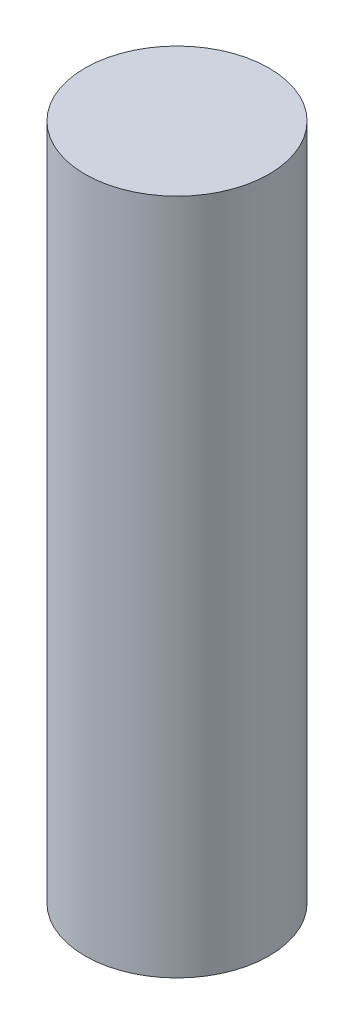
ISO-10303-21;
HEADER;
FILE_DESCRIPTION(('STEP AP214'),'2;1');
FILE_NAME('part.step','',(''),(''),'','','');
FILE_SCHEMA(('AUTOMOTIVE_DESIGN { 1 0 10303 214 1 1 1 1 }'));
ENDSEC;
DATA;
#1=APPLICATION_CONTEXT('core data for automotive mechanical design processes');
#2=APPLICATION_PROTOCOL_DEFINITION('international standard','automotive_design',2000,#1);
#3=PRODUCT_CONTEXT('',#1,'mechanical');
#4=PRODUCT('Part','Part','',(#3));
#5=PRODUCT_RELATED_PRODUCT_CATEGORY('part','',(#4));
#6=PRODUCT_DEFINITION_FORMATION('','',#4);
#7=PRODUCT_DEFINITION_CONTEXT('part definition',#1,'design');
#8=PRODUCT_DEFINITION('design','',#6,#7);
#9=PRODUCT_DEFINITION_SHAPE('','',#8);
#10=(LENGTH_UNIT() NAMED_UNIT(*) SI_UNIT(.MILLI.,.METRE.));
#11=(NAMED_UNIT(*) PLANE_ANGLE_UNIT() SI_UNIT($,.RADIAN.));
#12=(NAMED_UNIT(*) SI_UNIT($,.STERADIAN.) SOLID_ANGLE_UNIT());
#13=UNCERTAINTY_MEASURE_WITH_UNIT(LENGTH_MEASURE(1.E-05),#10,'distance_accuracy_value','');
#14=(GEOMETRIC_REPRESENTATION_CONTEXT(3) GLOBAL_UNCERTAINTY_ASSIGNED_CONTEXT((#13)) GLOBAL_UNIT_ASSIGNED_CONTEXT((#10,
#11,#12)) REPRESENTATION_CONTEXT('',''));
#15=CARTESIAN_POINT('',(0.,0.,0.));
#16=DIRECTION('',(0.,0.,1.));
#17=DIRECTION('',(1.,0.,0.));
#18=AXIS2_PLACEMENT_3D('',#15,#16,#17);
#19=CARTESIAN_POINT('',(0.,18.4,0.));
#20=DIRECTION('',(0.,-1.,0.));
#21=DIRECTION('',(0.,0.,-1.));
#22=AXIS2_PLACEMENT_3D('',#19,#20,#21);
#23=CYLINDRICAL_SURFACE('',#22,2.5);
#24=CARTESIAN_POINT('',(0.,18.4,0.));
#25=DIRECTION('',(0.,1.,0.));
#26=DIRECTION('',(0.,0.,1.));
#27=AXIS2_PLACEMENT_3D('',#24,#25,#26);
#28=CIRCLE('',#27,2.5);
#29=CARTESIAN_POINT('',(0.,18.4,2.5));
#30=VERTEX_POINT('',#29);
#31=EDGE_CURVE('E10',#30,#30,#28,.T.);
#32=ORIENTED_EDGE('',*,*,#31,.F.);
#33=EDGE_LOOP('',(#32));
#34=FACE_BOUND('',#33,.T.);
#35=CARTESIAN_POINT('',(0.,0.,0.));
#36=DIRECTION('',(0.,1.,0.));
#37=DIRECTION('',(0.,0.,1.));
#38=AXIS2_PLACEMENT_3D('',#35,#36,#37);
#39=CIRCLE('',#38,2.5);
#40=CARTESIAN_POINT('',(0.,0.,2.5));
#41=VERTEX_POINT('',#40);
#42=EDGE_CURVE('E34',#41,#41,#39,.T.);
#43=ORIENTED_EDGE('',*,*,#42,.T.);
#44=EDGE_LOOP('',(#43));
#45=FACE_BOUND('',#44,.T.);
#46=ADVANCED_FACE('F31',(#34,#45),#23,.T.);
#47=CARTESIAN_POINT('',(0.,18.4,0.));
#48=DIRECTION('',(0.,1.,0.));
#49=DIRECTION('',(0.,0.,1.));
#50=AXIS2_PLACEMENT_3D('',#47,#48,#49);
#51=PLANE('',#50);
#52=ORIENTED_EDGE('',*,*,#31,.T.);
#53=EDGE_LOOP('',(#52));
#54=FACE_BOUND('',#53,.T.);
#55=ADVANCED_FACE('F46',(#54),#51,.T.);
#56=CARTESIAN_POINT('',(0.,0.,0.));
#57=DIRECTION('',(0.,1.,0.));
#58=DIRECTION('',(0.,0.,1.));
#59=AXIS2_PLACEMENT_3D('',#56,#57,#58);
#60=PLANE('',#59);
#61=ORIENTED_EDGE('',*,*,#42,.F.);
#62=EDGE_LOOP('',(#61));
#63=FACE_BOUND('',#62,.T.);
#64=ADVANCED_FACE('F44',(#63),#60,.F.);
#65=CLOSED_SHELL('',(#46,#55,#64));
#66=MANIFOLD_SOLID_BREP('B2',#65);
#67=ADVANCED_BREP_SHAPE_REPRESENTATION('',(#18,#66),#14);
#68=SHAPE_DEFINITION_REPRESENTATION(#9,#67);
ENDSEC;
END-ISO-10303-21;
